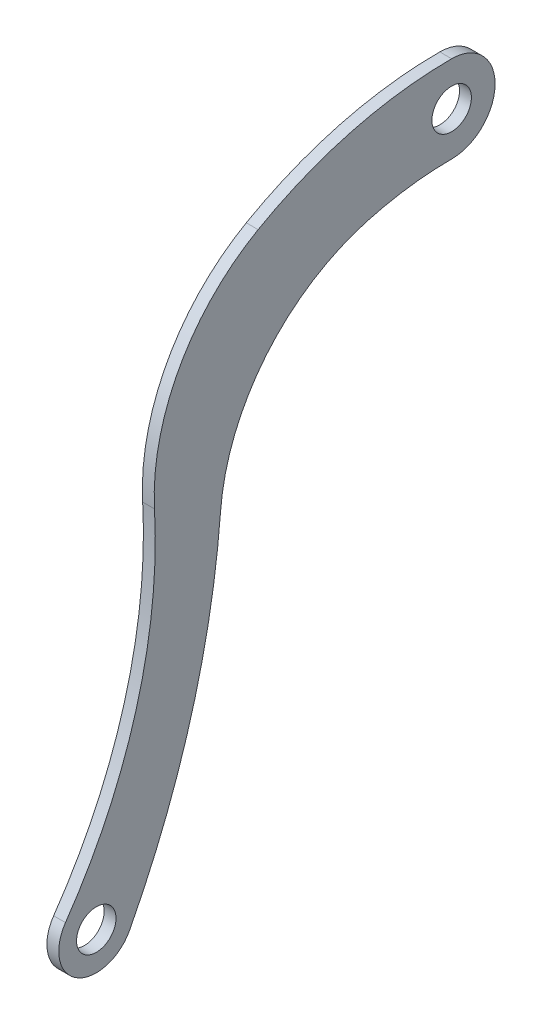
ISO-10303-21;
HEADER;
FILE_DESCRIPTION(('STEP AP214'),'2;1');
FILE_NAME('part.step','',(''),(''),'','','');
FILE_SCHEMA(('AUTOMOTIVE_DESIGN { 1 0 10303 214 1 1 1 1 }'));
ENDSEC;
DATA;
#1=APPLICATION_CONTEXT('core data for automotive mechanical design processes');
#2=APPLICATION_PROTOCOL_DEFINITION('international standard','automotive_design',2000,#1);
#3=PRODUCT_CONTEXT('',#1,'mechanical');
#4=PRODUCT('Part','Part','',(#3));
#5=PRODUCT_RELATED_PRODUCT_CATEGORY('part','',(#4));
#6=PRODUCT_DEFINITION_FORMATION('','',#4);
#7=PRODUCT_DEFINITION_CONTEXT('part definition',#1,'design');
#8=PRODUCT_DEFINITION('design','',#6,#7);
#9=PRODUCT_DEFINITION_SHAPE('','',#8);
#10=(LENGTH_UNIT() NAMED_UNIT(*) SI_UNIT(.MILLI.,.METRE.));
#11=(NAMED_UNIT(*) PLANE_ANGLE_UNIT() SI_UNIT($,.RADIAN.));
#12=(NAMED_UNIT(*) SI_UNIT($,.STERADIAN.) SOLID_ANGLE_UNIT());
#13=UNCERTAINTY_MEASURE_WITH_UNIT(LENGTH_MEASURE(1.E-05),#10,'distance_accuracy_value','');
#14=(GEOMETRIC_REPRESENTATION_CONTEXT(3) GLOBAL_UNCERTAINTY_ASSIGNED_CONTEXT((#13)) GLOBAL_UNIT_ASSIGNED_CONTEXT((#10,
#11,#12)) REPRESENTATION_CONTEXT('',''));
#15=CARTESIAN_POINT('',(0.,0.,0.));
#16=DIRECTION('',(0.,0.,1.));
#17=DIRECTION('',(1.,0.,0.));
#18=AXIS2_PLACEMENT_3D('',#15,#16,#17);
#19=CARTESIAN_POINT('',(1.5,-1.00000000000011,0.));
#20=DIRECTION('',(-1.,0.,0.));
#21=DIRECTION('',(0.,0.,1.));
#22=AXIS2_PLACEMENT_3D('',#19,#20,#21);
#23=CYLINDRICAL_SURFACE('',#22,80.0000000000001);
#24=CARTESIAN_POINT('',(-1.5,-1.00000000000011,0.));
#25=DIRECTION('',(-1.,0.,0.));
#26=DIRECTION('',(0.,0.,-1.));
#27=AXIS2_PLACEMENT_3D('',#24,#25,#26);
#28=CIRCLE('',#27,80.0000000000001);
#29=CARTESIAN_POINT('',(-1.5,76.1844516275808,21.0371202152204));
#30=VERTEX_POINT('',#29);
#31=CARTESIAN_POINT('',(-1.5,79.,0.));
#32=VERTEX_POINT('',#31);
#33=EDGE_CURVE('E133',#30,#32,#28,.T.);
#34=ORIENTED_EDGE('',*,*,#33,.T.);
#35=DIRECTION('',(-1.,0.,0.));
#36=VECTOR('',#35,1.);
#37=CARTESIAN_POINT('',(1.5,79.,0.));
#38=LINE('',#37,#36);
#39=CARTESIAN_POINT('',(1.5,79.,0.));
#40=VERTEX_POINT('',#39);
#41=EDGE_CURVE('E11',#40,#32,#38,.T.);
#42=ORIENTED_EDGE('',*,*,#41,.F.);
#43=CARTESIAN_POINT('',(1.5,-1.00000000000011,0.));
#44=DIRECTION('',(-1.,0.,0.));
#45=DIRECTION('',(0.,0.,-1.));
#46=AXIS2_PLACEMENT_3D('',#43,#44,#45);
#47=CIRCLE('',#46,80.0000000000001);
#48=CARTESIAN_POINT('',(1.5,76.1844516275808,21.0371202152204));
#49=VERTEX_POINT('',#48);
#50=EDGE_CURVE('E148',#49,#40,#47,.T.);
#51=ORIENTED_EDGE('',*,*,#50,.F.);
#52=DIRECTION('',(-1.,0.,0.));
#53=VECTOR('',#52,1.);
#54=CARTESIAN_POINT('',(1.5,76.1844516275808,21.0371202152204));
#55=LINE('',#54,#53);
#56=EDGE_CURVE('E129',#49,#30,#55,.T.);
#57=ORIENTED_EDGE('',*,*,#56,.T.);
#58=EDGE_LOOP('',(#34,#42,#51,#57));
#59=FACE_BOUND('',#58,.T.);
#60=ADVANCED_FACE('F37',(#59),#23,.F.);
#61=CARTESIAN_POINT('',(1.5,90.,0.));
#62=DIRECTION('',(-1.,0.,0.));
#63=DIRECTION('',(0.,0.,1.));
#64=AXIS2_PLACEMENT_3D('',#61,#62,#63);
#65=CYLINDRICAL_SURFACE('',#64,11.);
#66=CARTESIAN_POINT('',(-1.5,90.,0.));
#67=DIRECTION('',(1.,0.,0.));
#68=DIRECTION('',(0.,0.,-1.));
#69=AXIS2_PLACEMENT_3D('',#66,#67,#68);
#70=CIRCLE('',#69,11.);
#71=CARTESIAN_POINT('',(-1.5,101.,0.));
#72=VERTEX_POINT('',#71);
#73=EDGE_CURVE('E136',#32,#72,#70,.T.);
#74=ORIENTED_EDGE('',*,*,#73,.T.);
#75=DIRECTION('',(-1.,0.,0.));
#76=VECTOR('',#75,1.);
#77=CARTESIAN_POINT('',(1.5,101.,0.));
#78=LINE('',#77,#76);
#79=CARTESIAN_POINT('',(1.5,101.,0.));
#80=VERTEX_POINT('',#79);
#81=EDGE_CURVE('E45',#80,#72,#78,.T.);
#82=ORIENTED_EDGE('',*,*,#81,.F.);
#83=CARTESIAN_POINT('',(1.5,90.,0.));
#84=DIRECTION('',(1.,0.,0.));
#85=DIRECTION('',(0.,0.,-1.));
#86=AXIS2_PLACEMENT_3D('',#83,#84,#85);
#87=CIRCLE('',#86,11.);
#88=EDGE_CURVE('E96',#40,#80,#87,.T.);
#89=ORIENTED_EDGE('',*,*,#88,.F.);
#90=ORIENTED_EDGE('',*,*,#41,.T.);
#91=EDGE_LOOP('',(#74,#82,#89,#90));
#92=FACE_BOUND('',#91,.T.);
#93=ADVANCED_FACE('F217',(#92),#65,.T.);
#94=CARTESIAN_POINT('',(1.5,1.91977862819653,0.));
#95=DIRECTION('',(-1.,0.,0.));
#96=DIRECTION('',(0.,0.,1.));
#97=AXIS2_PLACEMENT_3D('',#94,#95,#96);
#98=CYLINDRICAL_SURFACE('',#97,99.0802213718032);
#99=CARTESIAN_POINT('',(-1.5,1.91977862819653,0.));
#100=DIRECTION('',(1.,0.,0.));
#101=DIRECTION('',(0.,0.,-1.));
#102=AXIS2_PLACEMENT_3D('',#99,#100,#101);
#103=CIRCLE('',#102,99.0802213718032);
#104=CARTESIAN_POINT('',(-1.5,88.0273434034063,49.0140546738238));
#105=VERTEX_POINT('',#104);
#106=EDGE_CURVE('E139',#72,#105,#103,.T.);
#107=ORIENTED_EDGE('',*,*,#106,.T.);
#108=DIRECTION('',(-1.,0.,0.));
#109=VECTOR('',#108,1.);
#110=CARTESIAN_POINT('',(1.5,88.0273434034063,49.0140546738238));
#111=LINE('',#110,#109);
#112=CARTESIAN_POINT('',(1.5,88.0273434034063,49.0140546738238));
#113=VERTEX_POINT('',#112);
#114=EDGE_CURVE('E155',#113,#105,#111,.T.);
#115=ORIENTED_EDGE('',*,*,#114,.F.);
#116=CARTESIAN_POINT('',(1.5,1.91977862819653,0.));
#117=DIRECTION('',(1.,0.,0.));
#118=DIRECTION('',(0.,0.,-1.));
#119=AXIS2_PLACEMENT_3D('',#116,#117,#118);
#120=CIRCLE('',#119,99.0802213718032);
#121=EDGE_CURVE('E163',#80,#113,#120,.T.);
#122=ORIENTED_EDGE('',*,*,#121,.F.);
#123=ORIENTED_EDGE('',*,*,#81,.T.);
#124=EDGE_LOOP('',(#107,#115,#122,#123));
#125=FACE_BOUND('',#124,.T.);
#126=ADVANCED_FACE('F161',(#125),#98,.T.);
#127=CARTESIAN_POINT('',(1.5,42.7648047154145,23.249761470075));
#128=DIRECTION('',(-1.,0.,0.));
#129=DIRECTION('',(0.,0.,1.));
#130=AXIS2_PLACEMENT_3D('',#127,#128,#129);
#131=CYLINDRICAL_SURFACE('',#130,52.081630281422);
#132=CARTESIAN_POINT('',(-1.5,42.7648047154145,23.249761470075));
#133=DIRECTION('',(1.,0.,0.));
#134=DIRECTION('',(0.,0.,-1.));
#135=AXIS2_PLACEMENT_3D('',#132,#133,#134);
#136=CIRCLE('',#135,52.081630281422);
#137=CARTESIAN_POINT('',(-1.5,39.8944297401121,75.2522341062093));
#138=VERTEX_POINT('',#137);
#139=EDGE_CURVE('E141',#105,#138,#136,.T.);
#140=ORIENTED_EDGE('',*,*,#139,.T.);
#141=DIRECTION('',(-1.,0.,0.));
#142=VECTOR('',#141,1.);
#143=CARTESIAN_POINT('',(1.5,39.8944297401121,75.2522341062093));
#144=LINE('',#143,#142);
#145=CARTESIAN_POINT('',(1.5,39.8944297401121,75.2522341062093));
#146=VERTEX_POINT('',#145);
#147=EDGE_CURVE('E152',#146,#138,#144,.T.);
#148=ORIENTED_EDGE('',*,*,#147,.F.);
#149=CARTESIAN_POINT('',(1.5,42.7648047154145,23.249761470075));
#150=DIRECTION('',(1.,0.,0.));
#151=DIRECTION('',(0.,0.,-1.));
#152=AXIS2_PLACEMENT_3D('',#149,#150,#151);
#153=CIRCLE('',#152,52.081630281422);
#154=EDGE_CURVE('E175',#113,#146,#153,.T.);
#155=ORIENTED_EDGE('',*,*,#154,.F.);
#156=ORIENTED_EDGE('',*,*,#114,.T.);
#157=EDGE_LOOP('',(#140,#148,#155,#156));
#158=FACE_BOUND('',#157,.T.);
#159=ADVANCED_FACE('F171',(#158),#131,.T.);
#160=CARTESIAN_POINT('',(1.5,32.9020765385807,201.932427165833));
#161=DIRECTION('',(-1.,0.,0.));
#162=DIRECTION('',(0.,0.,1.));
#163=AXIS2_PLACEMENT_3D('',#160,#161,#162);
#164=CYLINDRICAL_SURFACE('',#163,126.873024386267);
#165=CARTESIAN_POINT('',(-1.5,32.9020765385807,201.932427165833));
#166=DIRECTION('',(-1.,0.,0.));
#167=DIRECTION('',(0.,0.,1.));
#168=AXIS2_PLACEMENT_3D('',#165,#166,#167);
#169=CIRCLE('',#168,126.873024386267);
#170=CARTESIAN_POINT('',(-1.5,-39.573195612203,97.7974222751232));
#171=VERTEX_POINT('',#170);
#172=EDGE_CURVE('E143',#138,#171,#169,.T.);
#173=ORIENTED_EDGE('',*,*,#172,.T.);
#174=DIRECTION('',(-1.,0.,0.));
#175=VECTOR('',#174,1.);
#176=CARTESIAN_POINT('',(1.5,-39.573195612203,97.7974222751232));
#177=LINE('',#176,#175);
#178=CARTESIAN_POINT('',(1.5,-39.573195612203,97.7974222751232));
#179=VERTEX_POINT('',#178);
#180=EDGE_CURVE('E124',#179,#171,#177,.T.);
#181=ORIENTED_EDGE('',*,*,#180,.F.);
#182=CARTESIAN_POINT('',(1.5,32.9020765385807,201.932427165833));
#183=DIRECTION('',(-1.,0.,0.));
#184=DIRECTION('',(0.,0.,1.));
#185=AXIS2_PLACEMENT_3D('',#182,#183,#184);
#186=CIRCLE('',#185,126.873024386267);
#187=EDGE_CURVE('E115',#146,#179,#186,.T.);
#188=ORIENTED_EDGE('',*,*,#187,.F.);
#189=ORIENTED_EDGE('',*,*,#147,.T.);
#190=EDGE_LOOP('',(#173,#181,#188,#189));
#191=FACE_BOUND('',#190,.T.);
#192=ADVANCED_FACE('F174',(#191),#164,.F.);
#193=CARTESIAN_POINT('',(1.5,-45.,90.));
#194=DIRECTION('',(-1.,0.,0.));
#195=DIRECTION('',(0.,0.,1.));
#196=AXIS2_PLACEMENT_3D('',#193,#194,#195);
#197=CYLINDRICAL_SURFACE('',#196,9.49999999999998);
#198=CARTESIAN_POINT('',(-1.5,-45.,90.));
#199=DIRECTION('',(1.,0.,0.));
#200=DIRECTION('',(0.,0.,-1.));
#201=AXIS2_PLACEMENT_3D('',#198,#199,#200);
#202=CIRCLE('',#201,9.49999999999998);
#203=CARTESIAN_POINT('',(-1.5,-49.3878025329469,81.5740170346799));
#204=VERTEX_POINT('',#203);
#205=EDGE_CURVE('E123',#171,#204,#202,.T.);
#206=ORIENTED_EDGE('',*,*,#205,.T.);
#207=DIRECTION('',(-1.,0.,0.));
#208=VECTOR('',#207,1.);
#209=CARTESIAN_POINT('',(1.5,-49.3878025329469,81.5740170346799));
#210=LINE('',#209,#208);
#211=CARTESIAN_POINT('',(1.5,-49.3878025329469,81.5740170346799));
#212=VERTEX_POINT('',#211);
#213=EDGE_CURVE('E120',#212,#204,#210,.T.);
#214=ORIENTED_EDGE('',*,*,#213,.F.);
#215=CARTESIAN_POINT('',(1.5,-45.,90.));
#216=DIRECTION('',(1.,0.,0.));
#217=DIRECTION('',(0.,0.,-1.));
#218=AXIS2_PLACEMENT_3D('',#215,#216,#217);
#219=CIRCLE('',#218,9.49999999999998);
#220=EDGE_CURVE('E109',#179,#212,#219,.T.);
#221=ORIENTED_EDGE('',*,*,#220,.F.);
#222=ORIENTED_EDGE('',*,*,#180,.T.);
#223=EDGE_LOOP('',(#206,#214,#221,#222));
#224=FACE_BOUND('',#223,.T.);
#225=ADVANCED_FACE('F121',(#224),#197,.T.);
#226=CARTESIAN_POINT('',(1.5,47.4099976930229,267.456724759156));
#227=DIRECTION('',(-1.,0.,0.));
#228=DIRECTION('',(0.,0.,1.));
#229=AXIS2_PLACEMENT_3D('',#226,#227,#228);
#230=CYLINDRICAL_SURFACE('',#229,209.576227563074);
#231=CARTESIAN_POINT('',(-1.5,47.4099976930229,267.456724759156));
#232=DIRECTION('',(1.,0.,0.));
#233=DIRECTION('',(0.,0.,1.));
#234=AXIS2_PLACEMENT_3D('',#231,#232,#233);
#235=CIRCLE('',#234,209.576227563074);
#236=CARTESIAN_POINT('',(-1.5,30.9171877623671,58.5304641307682));
#237=VERTEX_POINT('',#236);
#238=EDGE_CURVE('E82',#204,#237,#235,.T.);
#239=ORIENTED_EDGE('',*,*,#238,.T.);
#240=DIRECTION('',(-1.,0.,0.));
#241=VECTOR('',#240,1.);
#242=CARTESIAN_POINT('',(1.5,30.9171877623671,58.5304641307682));
#243=LINE('',#242,#241);
#244=CARTESIAN_POINT('',(1.5,30.9171877623671,58.5304641307682));
#245=VERTEX_POINT('',#244);
#246=EDGE_CURVE('E125',#245,#237,#243,.T.);
#247=ORIENTED_EDGE('',*,*,#246,.F.);
#248=CARTESIAN_POINT('',(1.5,47.4099976930229,267.456724759156));
#249=DIRECTION('',(1.,0.,0.));
#250=DIRECTION('',(0.,0.,1.));
#251=AXIS2_PLACEMENT_3D('',#248,#249,#250);
#252=CIRCLE('',#251,209.576227563074);
#253=EDGE_CURVE('E113',#212,#245,#252,.T.);
#254=ORIENTED_EDGE('',*,*,#253,.F.);
#255=ORIENTED_EDGE('',*,*,#213,.T.);
#256=EDGE_LOOP('',(#239,#247,#254,#255));
#257=FACE_BOUND('',#256,.T.);
#258=ADVANCED_FACE('F127',(#257),#230,.T.);
#259=CARTESIAN_POINT('',(1.5,26.8969715166799,7.60349955284603));
#260=DIRECTION('',(-1.,0.,0.));
#261=DIRECTION('',(0.,0.,1.));
#262=AXIS2_PLACEMENT_3D('',#259,#260,#261);
#263=CYLINDRICAL_SURFACE('',#262,51.0853977158153);
#264=CARTESIAN_POINT('',(-1.5,26.8969715166799,7.60349955284603));
#265=DIRECTION('',(-1.,0.,0.));
#266=DIRECTION('',(0.,0.,-1.));
#267=AXIS2_PLACEMENT_3D('',#264,#265,#266);
#268=CIRCLE('',#267,51.0853977158153);
#269=EDGE_CURVE('E88',#237,#30,#268,.T.);
#270=ORIENTED_EDGE('',*,*,#269,.T.);
#271=ORIENTED_EDGE('',*,*,#56,.F.);
#272=CARTESIAN_POINT('',(1.5,26.8969715166799,7.60349955284603));
#273=DIRECTION('',(-1.,0.,0.));
#274=DIRECTION('',(0.,0.,-1.));
#275=AXIS2_PLACEMENT_3D('',#272,#273,#274);
#276=CIRCLE('',#275,51.0853977158153);
#277=EDGE_CURVE('E53',#245,#49,#276,.T.);
#278=ORIENTED_EDGE('',*,*,#277,.F.);
#279=ORIENTED_EDGE('',*,*,#246,.T.);
#280=EDGE_LOOP('',(#270,#271,#278,#279));
#281=FACE_BOUND('',#280,.T.);
#282=ADVANCED_FACE('F204',(#281),#263,.F.);
#283=CARTESIAN_POINT('',(1.5,12.9484857583399,3.80174977642301));
#284=DIRECTION('',(1.,0.,0.));
#285=DIRECTION('',(0.,0.,-1.));
#286=AXIS2_PLACEMENT_3D('',#283,#284,#285);
#287=PLANE('',#286);
#288=CARTESIAN_POINT('',(1.5,90.,0.));
#289=DIRECTION('',(1.,0.,0.));
#290=DIRECTION('',(0.,0.,-1.));
#291=AXIS2_PLACEMENT_3D('',#288,#289,#290);
#292=CIRCLE('',#291,5.);
#293=CARTESIAN_POINT('',(1.5,90.,-5.));
#294=VERTEX_POINT('',#293);
#295=EDGE_CURVE('E187',#294,#294,#292,.T.);
#296=ORIENTED_EDGE('',*,*,#295,.F.);
#297=EDGE_LOOP('',(#296));
#298=FACE_BOUND('',#297,.T.);
#299=CARTESIAN_POINT('',(1.5,-45.,90.));
#300=DIRECTION('',(1.,0.,0.));
#301=DIRECTION('',(0.,0.,-1.));
#302=AXIS2_PLACEMENT_3D('',#299,#300,#301);
#303=CIRCLE('',#302,5.00000000000001);
#304=CARTESIAN_POINT('',(1.5,-45.,85.));
#305=VERTEX_POINT('',#304);
#306=EDGE_CURVE('E181',#305,#305,#303,.T.);
#307=ORIENTED_EDGE('',*,*,#306,.F.);
#308=EDGE_LOOP('',(#307));
#309=FACE_BOUND('',#308,.T.);
#310=ORIENTED_EDGE('',*,*,#50,.T.);
#311=ORIENTED_EDGE('',*,*,#88,.T.);
#312=ORIENTED_EDGE('',*,*,#121,.T.);
#313=ORIENTED_EDGE('',*,*,#154,.T.);
#314=ORIENTED_EDGE('',*,*,#187,.T.);
#315=ORIENTED_EDGE('',*,*,#220,.T.);
#316=ORIENTED_EDGE('',*,*,#253,.T.);
#317=ORIENTED_EDGE('',*,*,#277,.T.);
#318=EDGE_LOOP('',(#310,#311,#312,#313,#314,#315,#316,#317));
#319=FACE_BOUND('',#318,.T.);
#320=ADVANCED_FACE('F111',(#298,#309,#319),#287,.T.);
#321=CARTESIAN_POINT('',(-1.5,12.9484857583399,3.80174977642301));
#322=DIRECTION('',(1.,0.,0.));
#323=DIRECTION('',(0.,0.,-1.));
#324=AXIS2_PLACEMENT_3D('',#321,#322,#323);
#325=PLANE('',#324);
#326=CARTESIAN_POINT('',(-1.5,90.,0.));
#327=DIRECTION('',(1.,0.,0.));
#328=DIRECTION('',(0.,0.,-1.));
#329=AXIS2_PLACEMENT_3D('',#326,#327,#328);
#330=CIRCLE('',#329,5.);
#331=CARTESIAN_POINT('',(-1.5,90.,-5.));
#332=VERTEX_POINT('',#331);
#333=EDGE_CURVE('E137',#332,#332,#330,.T.);
#334=ORIENTED_EDGE('',*,*,#333,.T.);
#335=EDGE_LOOP('',(#334));
#336=FACE_BOUND('',#335,.T.);
#337=CARTESIAN_POINT('',(-1.5,-45.,90.));
#338=DIRECTION('',(1.,0.,0.));
#339=DIRECTION('',(0.,0.,-1.));
#340=AXIS2_PLACEMENT_3D('',#337,#338,#339);
#341=CIRCLE('',#340,5.00000000000001);
#342=CARTESIAN_POINT('',(-1.5,-45.,85.));
#343=VERTEX_POINT('',#342);
#344=EDGE_CURVE('E184',#343,#343,#341,.T.);
#345=ORIENTED_EDGE('',*,*,#344,.T.);
#346=EDGE_LOOP('',(#345));
#347=FACE_BOUND('',#346,.T.);
#348=ORIENTED_EDGE('',*,*,#33,.F.);
#349=ORIENTED_EDGE('',*,*,#269,.F.);
#350=ORIENTED_EDGE('',*,*,#238,.F.);
#351=ORIENTED_EDGE('',*,*,#205,.F.);
#352=ORIENTED_EDGE('',*,*,#172,.F.);
#353=ORIENTED_EDGE('',*,*,#139,.F.);
#354=ORIENTED_EDGE('',*,*,#106,.F.);
#355=ORIENTED_EDGE('',*,*,#73,.F.);
#356=EDGE_LOOP('',(#348,#349,#350,#351,#352,#353,#354,#355));
#357=FACE_BOUND('',#356,.T.);
#358=ADVANCED_FACE('F167',(#336,#347,#357),#325,.F.);
#359=CARTESIAN_POINT('',(-1.5,-45.,90.));
#360=DIRECTION('',(1.,0.,0.));
#361=DIRECTION('',(0.,0.,-1.));
#362=AXIS2_PLACEMENT_3D('',#359,#360,#361);
#363=CYLINDRICAL_SURFACE('',#362,5.00000000000001);
#364=ORIENTED_EDGE('',*,*,#344,.F.);
#365=EDGE_LOOP('',(#364));
#366=FACE_BOUND('',#365,.T.);
#367=ORIENTED_EDGE('',*,*,#306,.T.);
#368=EDGE_LOOP('',(#367));
#369=FACE_BOUND('',#368,.T.);
#370=ADVANCED_FACE('F198',(#366,#369),#363,.F.);
#371=CARTESIAN_POINT('',(-1.5,90.,0.));
#372=DIRECTION('',(1.,0.,0.));
#373=DIRECTION('',(0.,0.,-1.));
#374=AXIS2_PLACEMENT_3D('',#371,#372,#373);
#375=CYLINDRICAL_SURFACE('',#374,5.);
#376=ORIENTED_EDGE('',*,*,#333,.F.);
#377=EDGE_LOOP('',(#376));
#378=FACE_BOUND('',#377,.T.);
#379=ORIENTED_EDGE('',*,*,#295,.T.);
#380=EDGE_LOOP('',(#379));
#381=FACE_BOUND('',#380,.T.);
#382=ADVANCED_FACE('F195',(#378,#381),#375,.F.);
#383=CLOSED_SHELL('',(#60,#93,#126,#159,#192,#225,#258,#282,#320,#358,#370,#382));
#384=MANIFOLD_SOLID_BREP('B2',#383);
#385=ADVANCED_BREP_SHAPE_REPRESENTATION('',(#18,#384),#14);
#386=SHAPE_DEFINITION_REPRESENTATION(#9,#385);
ENDSEC;
END-ISO-10303-21;
